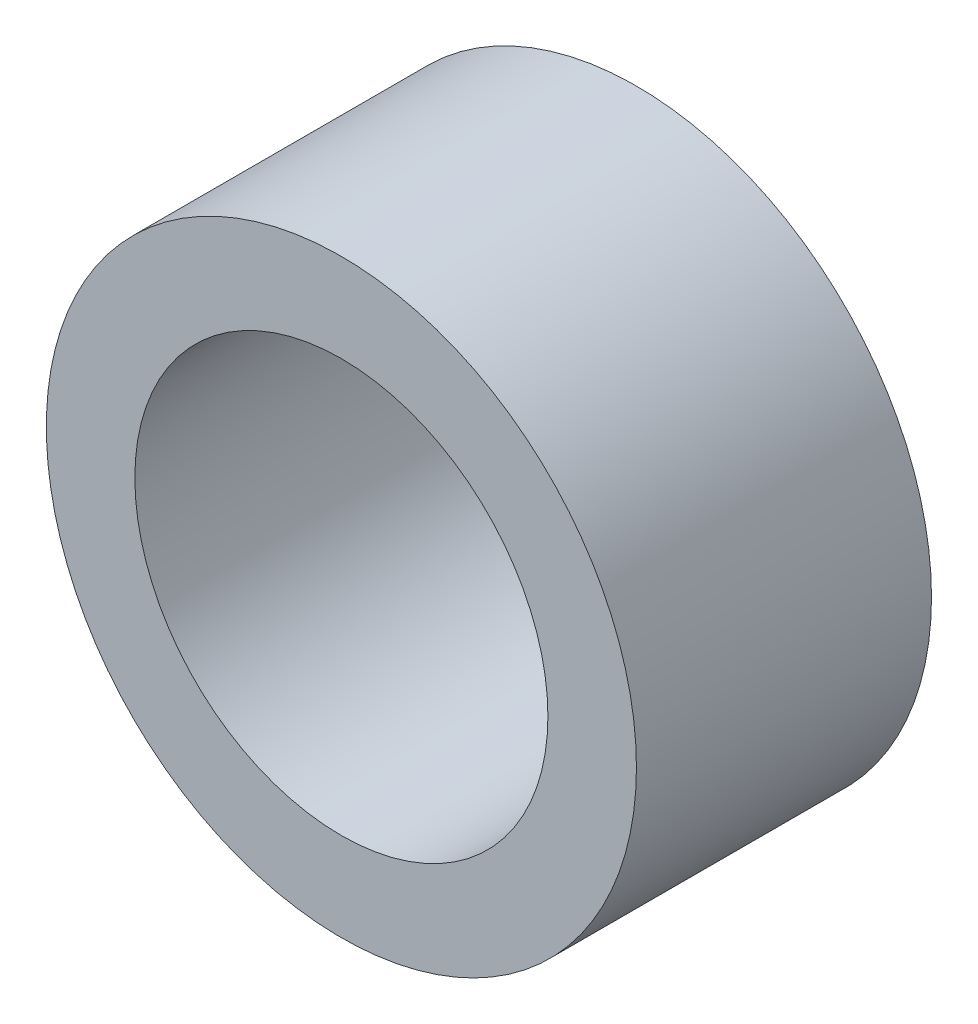
ISO-10303-21;
HEADER;
FILE_DESCRIPTION(('STEP AP214'),'2;1');
FILE_NAME('part.step','',(''),(''),'','','');
FILE_SCHEMA(('AUTOMOTIVE_DESIGN { 1 0 10303 214 1 1 1 1 }'));
ENDSEC;
DATA;
#1=APPLICATION_CONTEXT('core data for automotive mechanical design processes');
#2=APPLICATION_PROTOCOL_DEFINITION('international standard','automotive_design',2000,#1);
#3=PRODUCT_CONTEXT('',#1,'mechanical');
#4=PRODUCT('Part','Part','',(#3));
#5=PRODUCT_RELATED_PRODUCT_CATEGORY('part','',(#4));
#6=PRODUCT_DEFINITION_FORMATION('','',#4);
#7=PRODUCT_DEFINITION_CONTEXT('part definition',#1,'design');
#8=PRODUCT_DEFINITION('design','',#6,#7);
#9=PRODUCT_DEFINITION_SHAPE('','',#8);
#10=(LENGTH_UNIT() NAMED_UNIT(*) SI_UNIT(.MILLI.,.METRE.));
#11=(NAMED_UNIT(*) PLANE_ANGLE_UNIT() SI_UNIT($,.RADIAN.));
#12=(NAMED_UNIT(*) SI_UNIT($,.STERADIAN.) SOLID_ANGLE_UNIT());
#13=UNCERTAINTY_MEASURE_WITH_UNIT(LENGTH_MEASURE(1.E-05),#10,'distance_accuracy_value','');
#14=(GEOMETRIC_REPRESENTATION_CONTEXT(3) GLOBAL_UNCERTAINTY_ASSIGNED_CONTEXT((#13)) GLOBAL_UNIT_ASSIGNED_CONTEXT((#10,
#11,#12)) REPRESENTATION_CONTEXT('',''));
#15=CARTESIAN_POINT('',(0.,0.,0.));
#16=DIRECTION('',(0.,0.,1.));
#17=DIRECTION('',(1.,0.,0.));
#18=AXIS2_PLACEMENT_3D('',#15,#16,#17);
#19=CARTESIAN_POINT('',(0.,0.,3.));
#20=DIRECTION('',(0.,0.,1.));
#21=DIRECTION('',(1.,0.,0.));
#22=AXIS2_PLACEMENT_3D('',#19,#20,#21);
#23=PLANE('',#22);
#24=CARTESIAN_POINT('',(0.,0.,3.));
#25=DIRECTION('',(0.,0.,1.));
#26=DIRECTION('',(1.,0.,0.));
#27=AXIS2_PLACEMENT_3D('',#24,#25,#26);
#28=CIRCLE('',#27,3.);
#29=CARTESIAN_POINT('',(3.,0.,3.));
#30=VERTEX_POINT('',#29);
#31=EDGE_CURVE('E10',#30,#30,#28,.T.);
#32=ORIENTED_EDGE('',*,*,#31,.T.);
#33=EDGE_LOOP('',(#32));
#34=FACE_BOUND('',#33,.T.);
#35=CARTESIAN_POINT('',(0.,0.,3.));
#36=DIRECTION('',(0.,0.,1.));
#37=DIRECTION('',(1.,0.,0.));
#38=AXIS2_PLACEMENT_3D('',#35,#36,#37);
#39=CIRCLE('',#38,2.1);
#40=CARTESIAN_POINT('',(2.1,0.,3.));
#41=VERTEX_POINT('',#40);
#42=EDGE_CURVE('E43',#41,#41,#39,.T.);
#43=ORIENTED_EDGE('',*,*,#42,.F.);
#44=EDGE_LOOP('',(#43));
#45=FACE_BOUND('',#44,.T.);
#46=ADVANCED_FACE('F32',(#34,#45),#23,.T.);
#47=CARTESIAN_POINT('',(0.,0.,0.));
#48=DIRECTION('',(0.,0.,1.));
#49=DIRECTION('',(1.,0.,0.));
#50=AXIS2_PLACEMENT_3D('',#47,#48,#49);
#51=PLANE('',#50);
#52=CARTESIAN_POINT('',(0.,0.,0.));
#53=DIRECTION('',(0.,0.,1.));
#54=DIRECTION('',(1.,0.,0.));
#55=AXIS2_PLACEMENT_3D('',#52,#53,#54);
#56=CIRCLE('',#55,3.);
#57=CARTESIAN_POINT('',(3.,0.,0.));
#58=VERTEX_POINT('',#57);
#59=EDGE_CURVE('E36',#58,#58,#56,.T.);
#60=ORIENTED_EDGE('',*,*,#59,.F.);
#61=EDGE_LOOP('',(#60));
#62=FACE_BOUND('',#61,.T.);
#63=CARTESIAN_POINT('',(0.,0.,0.));
#64=DIRECTION('',(0.,0.,1.));
#65=DIRECTION('',(1.,0.,0.));
#66=AXIS2_PLACEMENT_3D('',#63,#64,#65);
#67=CIRCLE('',#66,2.1);
#68=CARTESIAN_POINT('',(2.1,0.,0.));
#69=VERTEX_POINT('',#68);
#70=EDGE_CURVE('E45',#69,#69,#67,.T.);
#71=ORIENTED_EDGE('',*,*,#70,.T.);
#72=EDGE_LOOP('',(#71));
#73=FACE_BOUND('',#72,.T.);
#74=ADVANCED_FACE('F55',(#62,#73),#51,.F.);
#75=CARTESIAN_POINT('',(0.,0.,3.));
#76=DIRECTION('',(0.,0.,-1.));
#77=DIRECTION('',(-1.,0.,0.));
#78=AXIS2_PLACEMENT_3D('',#75,#76,#77);
#79=CYLINDRICAL_SURFACE('',#78,3.);
#80=ORIENTED_EDGE('',*,*,#31,.F.);
#81=EDGE_LOOP('',(#80));
#82=FACE_BOUND('',#81,.T.);
#83=ORIENTED_EDGE('',*,*,#59,.T.);
#84=EDGE_LOOP('',(#83));
#85=FACE_BOUND('',#84,.T.);
#86=ADVANCED_FACE('F34',(#82,#85),#79,.T.);
#87=CARTESIAN_POINT('',(0.,0.,3.));
#88=DIRECTION('',(0.,0.,-1.));
#89=DIRECTION('',(-1.,0.,0.));
#90=AXIS2_PLACEMENT_3D('',#87,#88,#89);
#91=CYLINDRICAL_SURFACE('',#90,2.1);
#92=ORIENTED_EDGE('',*,*,#42,.T.);
#93=EDGE_LOOP('',(#92));
#94=FACE_BOUND('',#93,.T.);
#95=ORIENTED_EDGE('',*,*,#70,.F.);
#96=EDGE_LOOP('',(#95));
#97=FACE_BOUND('',#96,.T.);
#98=ADVANCED_FACE('F51',(#94,#97),#91,.F.);
#99=CLOSED_SHELL('',(#46,#74,#86,#98));
#100=MANIFOLD_SOLID_BREP('B2',#99);
#101=ADVANCED_BREP_SHAPE_REPRESENTATION('',(#18,#100),#14);
#102=SHAPE_DEFINITION_REPRESENTATION(#9,#101);
ENDSEC;
END-ISO-10303-21;
